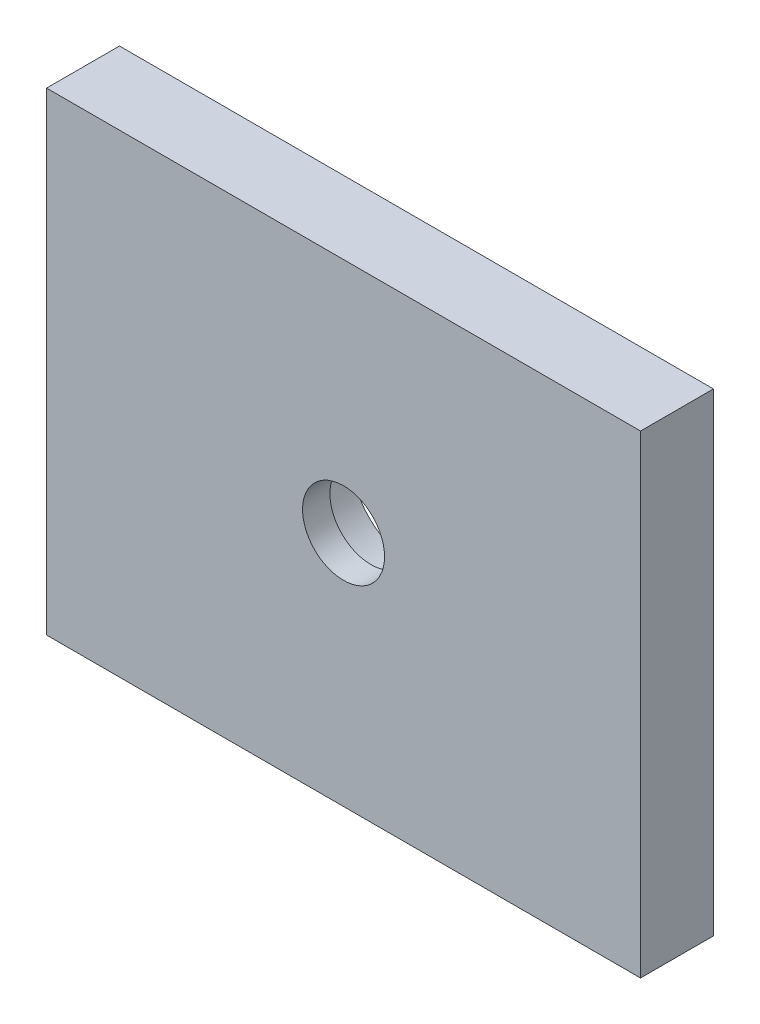
ISO-10303-21;
HEADER;
FILE_DESCRIPTION(('STEP AP214'),'2;1');
FILE_NAME('part.step','',(''),(''),'','','');
FILE_SCHEMA(('AUTOMOTIVE_DESIGN { 1 0 10303 214 1 1 1 1 }'));
ENDSEC;
DATA;
#1=APPLICATION_CONTEXT('core data for automotive mechanical design processes');
#2=APPLICATION_PROTOCOL_DEFINITION('international standard','automotive_design',2000,#1);
#3=PRODUCT_CONTEXT('',#1,'mechanical');
#4=PRODUCT('Part','Part','',(#3));
#5=PRODUCT_RELATED_PRODUCT_CATEGORY('part','',(#4));
#6=PRODUCT_DEFINITION_FORMATION('','',#4);
#7=PRODUCT_DEFINITION_CONTEXT('part definition',#1,'design');
#8=PRODUCT_DEFINITION('design','',#6,#7);
#9=PRODUCT_DEFINITION_SHAPE('','',#8);
#10=(LENGTH_UNIT() NAMED_UNIT(*) SI_UNIT(.MILLI.,.METRE.));
#11=(NAMED_UNIT(*) PLANE_ANGLE_UNIT() SI_UNIT($,.RADIAN.));
#12=(NAMED_UNIT(*) SI_UNIT($,.STERADIAN.) SOLID_ANGLE_UNIT());
#13=UNCERTAINTY_MEASURE_WITH_UNIT(LENGTH_MEASURE(1.E-05),#10,'distance_accuracy_value','');
#14=(GEOMETRIC_REPRESENTATION_CONTEXT(3) GLOBAL_UNCERTAINTY_ASSIGNED_CONTEXT((#13)) GLOBAL_UNIT_ASSIGNED_CONTEXT((#10,
#11,#12)) REPRESENTATION_CONTEXT('',''));
#15=CARTESIAN_POINT('',(0.,0.,0.));
#16=DIRECTION('',(0.,0.,1.));
#17=DIRECTION('',(1.,0.,0.));
#18=AXIS2_PLACEMENT_3D('',#15,#16,#17);
#19=CARTESIAN_POINT('',(0.,0.,-4.));
#20=DIRECTION('',(-1.,0.,0.));
#21=DIRECTION('',(0.,0.,-1.));
#22=AXIS2_PLACEMENT_3D('',#19,#20,#21);
#23=PLANE('',#22);
#24=DIRECTION('',(0.,1.,0.));
#25=VECTOR('',#24,1.);
#26=CARTESIAN_POINT('',(0.,0.,0.));
#27=LINE('',#26,#25);
#28=CARTESIAN_POINT('',(0.,0.,0.));
#29=VERTEX_POINT('',#28);
#30=CARTESIAN_POINT('',(0.,26.,0.));
#31=VERTEX_POINT('',#30);
#32=EDGE_CURVE('E99',#29,#31,#27,.T.);
#33=ORIENTED_EDGE('',*,*,#32,.F.);
#34=DIRECTION('',(0.,0.,1.));
#35=VECTOR('',#34,1.);
#36=CARTESIAN_POINT('',(0.,0.,-4.));
#37=LINE('',#36,#35);
#38=CARTESIAN_POINT('',(0.,0.,-4.));
#39=VERTEX_POINT('',#38);
#40=EDGE_CURVE('E98',#39,#29,#37,.T.);
#41=ORIENTED_EDGE('',*,*,#40,.F.);
#42=DIRECTION('',(0.,1.,0.));
#43=VECTOR('',#42,1.);
#44=CARTESIAN_POINT('',(0.,0.,-4.));
#45=LINE('',#44,#43);
#46=CARTESIAN_POINT('',(0.,26.,-4.));
#47=VERTEX_POINT('',#46);
#48=EDGE_CURVE('E92',#39,#47,#45,.T.);
#49=ORIENTED_EDGE('',*,*,#48,.T.);
#50=DIRECTION('',(0.,0.,1.));
#51=VECTOR('',#50,1.);
#52=CARTESIAN_POINT('',(0.,26.,-4.));
#53=LINE('',#52,#51);
#54=EDGE_CURVE('E11',#47,#31,#53,.T.);
#55=ORIENTED_EDGE('',*,*,#54,.T.);
#56=EDGE_LOOP('',(#33,#41,#49,#55));
#57=FACE_BOUND('',#56,.T.);
#58=ADVANCED_FACE('F35',(#57),#23,.F.);
#59=CARTESIAN_POINT('',(0.,26.,-4.));
#60=DIRECTION('',(0.,-1.,0.));
#61=DIRECTION('',(1.,0.,0.));
#62=AXIS2_PLACEMENT_3D('',#59,#60,#61);
#63=PLANE('',#62);
#64=DIRECTION('',(-1.,0.,0.));
#65=VECTOR('',#64,1.);
#66=CARTESIAN_POINT('',(0.,26.,0.));
#67=LINE('',#66,#65);
#68=CARTESIAN_POINT('',(-32.6,26.,0.));
#69=VERTEX_POINT('',#68);
#70=EDGE_CURVE('E101',#31,#69,#67,.T.);
#71=ORIENTED_EDGE('',*,*,#70,.F.);
#72=ORIENTED_EDGE('',*,*,#54,.F.);
#73=DIRECTION('',(-1.,0.,0.));
#74=VECTOR('',#73,1.);
#75=CARTESIAN_POINT('',(0.,26.,-4.));
#76=LINE('',#75,#74);
#77=CARTESIAN_POINT('',(-32.6,26.,-4.));
#78=VERTEX_POINT('',#77);
#79=EDGE_CURVE('E76',#47,#78,#76,.T.);
#80=ORIENTED_EDGE('',*,*,#79,.T.);
#81=DIRECTION('',(0.,0.,1.));
#82=VECTOR('',#81,1.);
#83=CARTESIAN_POINT('',(-32.6,26.,-4.));
#84=LINE('',#83,#82);
#85=EDGE_CURVE('E43',#78,#69,#84,.T.);
#86=ORIENTED_EDGE('',*,*,#85,.T.);
#87=EDGE_LOOP('',(#71,#72,#80,#86));
#88=FACE_BOUND('',#87,.T.);
#89=ADVANCED_FACE('F90',(#88),#63,.F.);
#90=CARTESIAN_POINT('',(-32.6,0.,-4.));
#91=DIRECTION('',(1.,0.,0.));
#92=DIRECTION('',(0.,0.,1.));
#93=AXIS2_PLACEMENT_3D('',#90,#91,#92);
#94=PLANE('',#93);
#95=DIRECTION('',(0.,-1.,0.));
#96=VECTOR('',#95,1.);
#97=CARTESIAN_POINT('',(-32.6,0.,0.));
#98=LINE('',#97,#96);
#99=CARTESIAN_POINT('',(-32.6,0.,0.));
#100=VERTEX_POINT('',#99);
#101=EDGE_CURVE('E86',#69,#100,#98,.T.);
#102=ORIENTED_EDGE('',*,*,#101,.F.);
#103=ORIENTED_EDGE('',*,*,#85,.F.);
#104=DIRECTION('',(0.,-1.,0.));
#105=VECTOR('',#104,1.);
#106=CARTESIAN_POINT('',(-32.6,0.,-4.));
#107=LINE('',#106,#105);
#108=CARTESIAN_POINT('',(-32.6,0.,-4.));
#109=VERTEX_POINT('',#108);
#110=EDGE_CURVE('E79',#78,#109,#107,.T.);
#111=ORIENTED_EDGE('',*,*,#110,.T.);
#112=DIRECTION('',(0.,0.,1.));
#113=VECTOR('',#112,1.);
#114=CARTESIAN_POINT('',(-32.6,0.,-4.));
#115=LINE('',#114,#113);
#116=EDGE_CURVE('E89',#109,#100,#115,.T.);
#117=ORIENTED_EDGE('',*,*,#116,.T.);
#118=EDGE_LOOP('',(#102,#103,#111,#117));
#119=FACE_BOUND('',#118,.T.);
#120=ADVANCED_FACE('F85',(#119),#94,.F.);
#121=CARTESIAN_POINT('',(0.,0.,-4.));
#122=DIRECTION('',(0.,1.,0.));
#123=DIRECTION('',(-1.,0.,0.));
#124=AXIS2_PLACEMENT_3D('',#121,#122,#123);
#125=PLANE('',#124);
#126=DIRECTION('',(1.,0.,0.));
#127=VECTOR('',#126,1.);
#128=CARTESIAN_POINT('',(0.,0.,0.));
#129=LINE('',#128,#127);
#130=EDGE_CURVE('E65',#100,#29,#129,.T.);
#131=ORIENTED_EDGE('',*,*,#130,.F.);
#132=ORIENTED_EDGE('',*,*,#116,.F.);
#133=DIRECTION('',(1.,0.,0.));
#134=VECTOR('',#133,1.);
#135=CARTESIAN_POINT('',(0.,0.,-4.));
#136=LINE('',#135,#134);
#137=EDGE_CURVE('E51',#109,#39,#136,.T.);
#138=ORIENTED_EDGE('',*,*,#137,.T.);
#139=ORIENTED_EDGE('',*,*,#40,.T.);
#140=EDGE_LOOP('',(#131,#132,#138,#139));
#141=FACE_BOUND('',#140,.T.);
#142=ADVANCED_FACE('F111',(#141),#125,.F.);
#143=CARTESIAN_POINT('',(0.,0.,-4.));
#144=DIRECTION('',(0.,0.,-1.));
#145=DIRECTION('',(1.,0.,0.));
#146=AXIS2_PLACEMENT_3D('',#143,#144,#145);
#147=PLANE('',#146);
#148=CARTESIAN_POINT('',(-16.3,13.,-4.));
#149=DIRECTION('',(0.,0.,1.));
#150=DIRECTION('',(1.,0.,0.));
#151=AXIS2_PLACEMENT_3D('',#148,#149,#150);
#152=CIRCLE('',#151,3.65);
#153=CARTESIAN_POINT('',(-12.65,13.,-4.));
#154=VERTEX_POINT('',#153);
#155=EDGE_CURVE('E192',#154,#154,#152,.T.);
#156=ORIENTED_EDGE('',*,*,#155,.T.);
#157=EDGE_LOOP('',(#156));
#158=FACE_BOUND('',#157,.T.);
#159=ORIENTED_EDGE('',*,*,#48,.F.);
#160=ORIENTED_EDGE('',*,*,#137,.F.);
#161=ORIENTED_EDGE('',*,*,#110,.F.);
#162=ORIENTED_EDGE('',*,*,#79,.F.);
#163=EDGE_LOOP('',(#159,#160,#161,#162));
#164=FACE_BOUND('',#163,.T.);
#165=ADVANCED_FACE('F81',(#158,#164),#147,.T.);
#166=CARTESIAN_POINT('',(0.,0.,0.));
#167=DIRECTION('',(0.,0.,-1.));
#168=DIRECTION('',(1.,0.,0.));
#169=AXIS2_PLACEMENT_3D('',#166,#167,#168);
#170=PLANE('',#169);
#171=CARTESIAN_POINT('',(-16.3,13.,0.));
#172=DIRECTION('',(0.,0.,1.));
#173=DIRECTION('',(1.,0.,0.));
#174=AXIS2_PLACEMENT_3D('',#171,#172,#173);
#175=CIRCLE('',#174,2.25);
#176=CARTESIAN_POINT('',(-14.05,13.,0.));
#177=VERTEX_POINT('',#176);
#178=EDGE_CURVE('E187',#177,#177,#175,.T.);
#179=ORIENTED_EDGE('',*,*,#178,.F.);
#180=EDGE_LOOP('',(#179));
#181=FACE_BOUND('',#180,.T.);
#182=ORIENTED_EDGE('',*,*,#32,.T.);
#183=ORIENTED_EDGE('',*,*,#70,.T.);
#184=ORIENTED_EDGE('',*,*,#101,.T.);
#185=ORIENTED_EDGE('',*,*,#130,.T.);
#186=EDGE_LOOP('',(#182,#183,#184,#185));
#187=FACE_BOUND('',#186,.T.);
#188=ADVANCED_FACE('F107',(#181,#187),#170,.F.);
#189=CARTESIAN_POINT('',(-16.3,13.,-1.5));
#190=DIRECTION('',(0.,0.,-1.));
#191=DIRECTION('',(1.,0.,0.));
#192=AXIS2_PLACEMENT_3D('',#189,#190,#191);
#193=CYLINDRICAL_SURFACE('',#192,3.65);
#194=CARTESIAN_POINT('',(-16.3,13.,-1.5));
#195=DIRECTION('',(0.,0.,1.));
#196=DIRECTION('',(1.,0.,0.));
#197=AXIS2_PLACEMENT_3D('',#194,#195,#196);
#198=CIRCLE('',#197,3.65);
#199=CARTESIAN_POINT('',(-12.65,13.,-1.5));
#200=VERTEX_POINT('',#199);
#201=EDGE_CURVE('E102',#200,#200,#198,.T.);
#202=ORIENTED_EDGE('',*,*,#201,.T.);
#203=EDGE_LOOP('',(#202));
#204=FACE_BOUND('',#203,.T.);
#205=ORIENTED_EDGE('',*,*,#155,.F.);
#206=EDGE_LOOP('',(#205));
#207=FACE_BOUND('',#206,.T.);
#208=ADVANCED_FACE('F151',(#204,#207),#193,.F.);
#209=CARTESIAN_POINT('',(-16.3,13.,-1.5));
#210=DIRECTION('',(0.,0.,-1.));
#211=DIRECTION('',(1.,0.,0.));
#212=AXIS2_PLACEMENT_3D('',#209,#210,#211);
#213=PLANE('',#212);
#214=CARTESIAN_POINT('',(-16.3,13.,-1.5));
#215=DIRECTION('',(0.,0.,1.));
#216=DIRECTION('',(1.,0.,0.));
#217=AXIS2_PLACEMENT_3D('',#214,#215,#216);
#218=CIRCLE('',#217,2.25);
#219=CARTESIAN_POINT('',(-14.05,13.,-1.5));
#220=VERTEX_POINT('',#219);
#221=EDGE_CURVE('E190',#220,#220,#218,.T.);
#222=ORIENTED_EDGE('',*,*,#221,.T.);
#223=EDGE_LOOP('',(#222));
#224=FACE_BOUND('',#223,.T.);
#225=ORIENTED_EDGE('',*,*,#201,.F.);
#226=EDGE_LOOP('',(#225));
#227=FACE_BOUND('',#226,.T.);
#228=ADVANCED_FACE('F160',(#224,#227),#213,.T.);
#229=CARTESIAN_POINT('',(-16.3,13.,0.));
#230=DIRECTION('',(0.,0.,-1.));
#231=DIRECTION('',(1.,0.,0.));
#232=AXIS2_PLACEMENT_3D('',#229,#230,#231);
#233=CYLINDRICAL_SURFACE('',#232,2.25);
#234=ORIENTED_EDGE('',*,*,#178,.T.);
#235=EDGE_LOOP('',(#234));
#236=FACE_BOUND('',#235,.T.);
#237=ORIENTED_EDGE('',*,*,#221,.F.);
#238=EDGE_LOOP('',(#237));
#239=FACE_BOUND('',#238,.T.);
#240=ADVANCED_FACE('F170',(#236,#239),#233,.F.);
#241=CLOSED_SHELL('',(#58,#89,#120,#142,#165,#188,#208,#228,#240));
#242=MANIFOLD_SOLID_BREP('B2',#241);
#243=ADVANCED_BREP_SHAPE_REPRESENTATION('',(#18,#242),#14);
#244=SHAPE_DEFINITION_REPRESENTATION(#9,#243);
ENDSEC;
END-ISO-10303-21;
